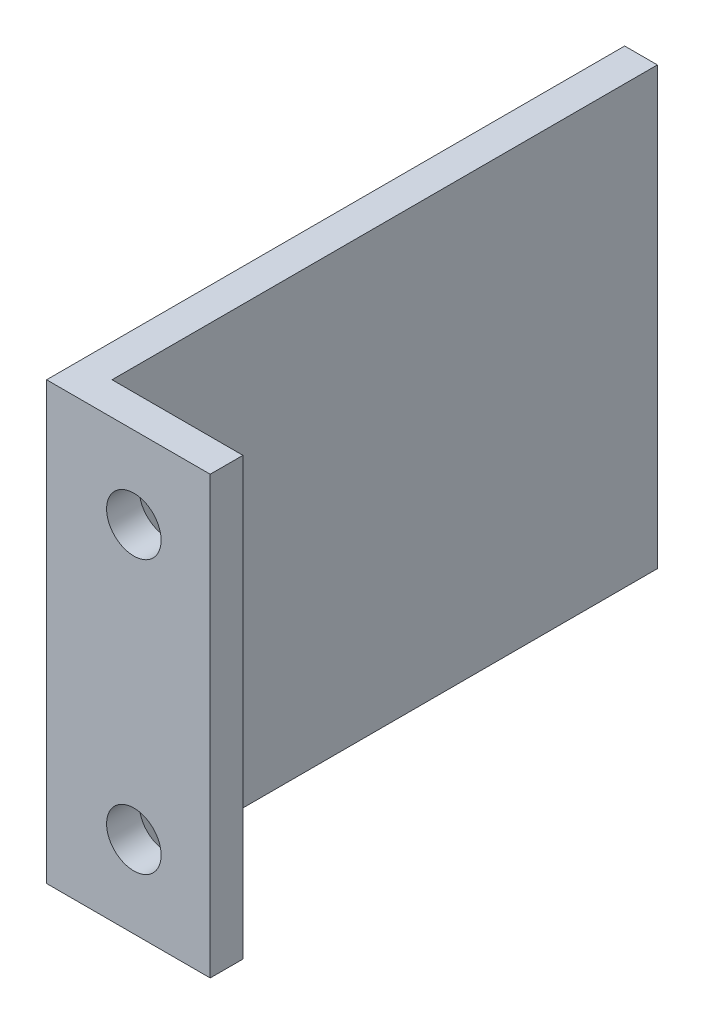
ISO-10303-21;
HEADER;
FILE_DESCRIPTION(('STEP AP214'),'2;1');
FILE_NAME('part.step','',(''),(''),'','','');
FILE_SCHEMA(('AUTOMOTIVE_DESIGN { 1 0 10303 214 1 1 1 1 }'));
ENDSEC;
DATA;
#1=APPLICATION_CONTEXT('core data for automotive mechanical design processes');
#2=APPLICATION_PROTOCOL_DEFINITION('international standard','automotive_design',2000,#1);
#3=PRODUCT_CONTEXT('',#1,'mechanical');
#4=PRODUCT('Part','Part','',(#3));
#5=PRODUCT_RELATED_PRODUCT_CATEGORY('part','',(#4));
#6=PRODUCT_DEFINITION_FORMATION('','',#4);
#7=PRODUCT_DEFINITION_CONTEXT('part definition',#1,'design');
#8=PRODUCT_DEFINITION('design','',#6,#7);
#9=PRODUCT_DEFINITION_SHAPE('','',#8);
#10=(LENGTH_UNIT() NAMED_UNIT(*) SI_UNIT(.MILLI.,.METRE.));
#11=(NAMED_UNIT(*) PLANE_ANGLE_UNIT() SI_UNIT($,.RADIAN.));
#12=(NAMED_UNIT(*) SI_UNIT($,.STERADIAN.) SOLID_ANGLE_UNIT());
#13=UNCERTAINTY_MEASURE_WITH_UNIT(LENGTH_MEASURE(1.E-05),#10,'distance_accuracy_value','');
#14=(GEOMETRIC_REPRESENTATION_CONTEXT(3) GLOBAL_UNCERTAINTY_ASSIGNED_CONTEXT((#13)) GLOBAL_UNIT_ASSIGNED_CONTEXT((#10,
#11,#12)) REPRESENTATION_CONTEXT('',''));
#15=CARTESIAN_POINT('',(0.,0.,0.));
#16=DIRECTION('',(0.,0.,1.));
#17=DIRECTION('',(1.,0.,0.));
#18=AXIS2_PLACEMENT_3D('',#15,#16,#17);
#19=CARTESIAN_POINT('',(0.,0.,0.));
#20=DIRECTION('',(0.,0.,1.));
#21=DIRECTION('',(1.,0.,0.));
#22=AXIS2_PLACEMENT_3D('',#19,#20,#21);
#23=PLANE('',#22);
#24=CARTESIAN_POINT('',(0.499999999999999,-12.5,0.));
#25=DIRECTION('',(0.,0.,1.));
#26=DIRECTION('',(1.,0.,0.));
#27=AXIS2_PLACEMENT_3D('',#24,#25,#26);
#28=CIRCLE('',#27,2.5);
#29=CARTESIAN_POINT('',(3.,-12.5,0.));
#30=VERTEX_POINT('',#29);
#31=EDGE_CURVE('E229',#30,#30,#28,.F.);
#32=ORIENTED_EDGE('',*,*,#31,.F.);
#33=EDGE_LOOP('',(#32));
#34=FACE_BOUND('',#33,.T.);
#35=CARTESIAN_POINT('',(0.499999999999999,12.5,0.));
#36=DIRECTION('',(0.,0.,1.));
#37=DIRECTION('',(1.,0.,0.));
#38=AXIS2_PLACEMENT_3D('',#35,#36,#37);
#39=CIRCLE('',#38,2.5);
#40=CARTESIAN_POINT('',(3.,12.5,0.));
#41=VERTEX_POINT('',#40);
#42=EDGE_CURVE('E115',#41,#41,#39,.F.);
#43=ORIENTED_EDGE('',*,*,#42,.F.);
#44=EDGE_LOOP('',(#43));
#45=FACE_BOUND('',#44,.T.);
#46=DIRECTION('',(0.,-1.,0.));
#47=VECTOR('',#46,1.);
#48=CARTESIAN_POINT('',(-4.5,-20.,0.));
#49=LINE('',#48,#47);
#50=CARTESIAN_POINT('',(-4.5,20.,0.));
#51=VERTEX_POINT('',#50);
#52=CARTESIAN_POINT('',(-4.5,-20.,0.));
#53=VERTEX_POINT('',#52);
#54=EDGE_CURVE('E48',#51,#53,#49,.T.);
#55=ORIENTED_EDGE('',*,*,#54,.F.);
#56=DIRECTION('',(-1.,0.,0.));
#57=VECTOR('',#56,1.);
#58=CARTESIAN_POINT('',(-7.5,20.,0.));
#59=LINE('',#58,#57);
#60=CARTESIAN_POINT('',(7.5,20.,0.));
#61=VERTEX_POINT('',#60);
#62=EDGE_CURVE('E134',#61,#51,#59,.T.);
#63=ORIENTED_EDGE('',*,*,#62,.F.);
#64=DIRECTION('',(0.,1.,0.));
#65=VECTOR('',#64,1.);
#66=CARTESIAN_POINT('',(7.5,20.,0.));
#67=LINE('',#66,#65);
#68=CARTESIAN_POINT('',(7.5,-20.,0.));
#69=VERTEX_POINT('',#68);
#70=EDGE_CURVE('E125',#69,#61,#67,.T.);
#71=ORIENTED_EDGE('',*,*,#70,.F.);
#72=DIRECTION('',(1.,0.,0.));
#73=VECTOR('',#72,1.);
#74=CARTESIAN_POINT('',(-7.5,-20.,0.));
#75=LINE('',#74,#73);
#76=EDGE_CURVE('E70',#53,#69,#75,.T.);
#77=ORIENTED_EDGE('',*,*,#76,.F.);
#78=EDGE_LOOP('',(#55,#63,#71,#77));
#79=FACE_BOUND('',#78,.T.);
#80=ADVANCED_FACE('F33',(#34,#45,#79),#23,.F.);
#81=CARTESIAN_POINT('',(7.5,20.,3.));
#82=DIRECTION('',(-1.,0.,0.));
#83=DIRECTION('',(0.,-1.,0.));
#84=AXIS2_PLACEMENT_3D('',#81,#82,#83);
#85=PLANE('',#84);
#86=ORIENTED_EDGE('',*,*,#70,.T.);
#87=DIRECTION('',(0.,0.,-1.));
#88=VECTOR('',#87,1.);
#89=CARTESIAN_POINT('',(7.5,20.,3.));
#90=LINE('',#89,#88);
#91=CARTESIAN_POINT('',(7.5,20.,3.));
#92=VERTEX_POINT('',#91);
#93=EDGE_CURVE('E11',#92,#61,#90,.T.);
#94=ORIENTED_EDGE('',*,*,#93,.F.);
#95=DIRECTION('',(0.,1.,0.));
#96=VECTOR('',#95,1.);
#97=CARTESIAN_POINT('',(7.5,20.,3.));
#98=LINE('',#97,#96);
#99=CARTESIAN_POINT('',(7.5,-20.,3.));
#100=VERTEX_POINT('',#99);
#101=EDGE_CURVE('E126',#100,#92,#98,.T.);
#102=ORIENTED_EDGE('',*,*,#101,.F.);
#103=DIRECTION('',(0.,0.,-1.));
#104=VECTOR('',#103,1.);
#105=CARTESIAN_POINT('',(7.5,-20.,3.));
#106=LINE('',#105,#104);
#107=EDGE_CURVE('E131',#100,#69,#106,.T.);
#108=ORIENTED_EDGE('',*,*,#107,.T.);
#109=EDGE_LOOP('',(#86,#94,#102,#108));
#110=FACE_BOUND('',#109,.T.);
#111=ADVANCED_FACE('F35',(#110),#85,.F.);
#112=CARTESIAN_POINT('',(-7.5,20.,3.));
#113=DIRECTION('',(0.,-1.,0.));
#114=DIRECTION('',(0.,0.,-1.));
#115=AXIS2_PLACEMENT_3D('',#112,#113,#114);
#116=PLANE('',#115);
#117=ORIENTED_EDGE('',*,*,#62,.T.);
#118=DIRECTION('',(0.,0.,1.));
#119=VECTOR('',#118,1.);
#120=CARTESIAN_POINT('',(-4.5,20.,-50.));
#121=LINE('',#120,#119);
#122=CARTESIAN_POINT('',(-4.5,20.,-50.));
#123=VERTEX_POINT('',#122);
#124=EDGE_CURVE('E105',#123,#51,#121,.T.);
#125=ORIENTED_EDGE('',*,*,#124,.F.);
#126=DIRECTION('',(1.,0.,0.));
#127=VECTOR('',#126,1.);
#128=CARTESIAN_POINT('',(-7.5,20.,-50.));
#129=LINE('',#128,#127);
#130=CARTESIAN_POINT('',(-7.5,20.,-50.));
#131=VERTEX_POINT('',#130);
#132=EDGE_CURVE('E102',#131,#123,#129,.T.);
#133=ORIENTED_EDGE('',*,*,#132,.F.);
#134=DIRECTION('',(0.,0.,-1.));
#135=VECTOR('',#134,1.);
#136=CARTESIAN_POINT('',(-7.5,20.,3.));
#137=LINE('',#136,#135);
#138=CARTESIAN_POINT('',(-7.5,20.,3.));
#139=VERTEX_POINT('',#138);
#140=EDGE_CURVE('E41',#139,#131,#137,.T.);
#141=ORIENTED_EDGE('',*,*,#140,.F.);
#142=DIRECTION('',(-1.,0.,0.));
#143=VECTOR('',#142,1.);
#144=CARTESIAN_POINT('',(-7.5,20.,3.));
#145=LINE('',#144,#143);
#146=EDGE_CURVE('E77',#92,#139,#145,.T.);
#147=ORIENTED_EDGE('',*,*,#146,.F.);
#148=ORIENTED_EDGE('',*,*,#93,.T.);
#149=EDGE_LOOP('',(#117,#125,#133,#141,#147,#148));
#150=FACE_BOUND('',#149,.T.);
#151=ADVANCED_FACE('F103',(#150),#116,.F.);
#152=CARTESIAN_POINT('',(-7.5,20.,3.));
#153=DIRECTION('',(1.,0.,0.));
#154=DIRECTION('',(0.,1.,0.));
#155=AXIS2_PLACEMENT_3D('',#152,#153,#154);
#156=PLANE('',#155);
#157=ORIENTED_EDGE('',*,*,#140,.T.);
#158=DIRECTION('',(0.,1.,0.));
#159=VECTOR('',#158,1.);
#160=CARTESIAN_POINT('',(-7.5,-20.,-50.));
#161=LINE('',#160,#159);
#162=CARTESIAN_POINT('',(-7.5,-20.,-50.));
#163=VERTEX_POINT('',#162);
#164=EDGE_CURVE('E98',#163,#131,#161,.T.);
#165=ORIENTED_EDGE('',*,*,#164,.F.);
#166=DIRECTION('',(0.,0.,-1.));
#167=VECTOR('',#166,1.);
#168=CARTESIAN_POINT('',(-7.5,-20.,3.));
#169=LINE('',#168,#167);
#170=CARTESIAN_POINT('',(-7.5,-20.,3.));
#171=VERTEX_POINT('',#170);
#172=EDGE_CURVE('E100',#171,#163,#169,.T.);
#173=ORIENTED_EDGE('',*,*,#172,.F.);
#174=DIRECTION('',(0.,-1.,0.));
#175=VECTOR('',#174,1.);
#176=CARTESIAN_POINT('',(-7.5,20.,3.));
#177=LINE('',#176,#175);
#178=EDGE_CURVE('E99',#139,#171,#177,.T.);
#179=ORIENTED_EDGE('',*,*,#178,.F.);
#180=EDGE_LOOP('',(#157,#165,#173,#179));
#181=FACE_BOUND('',#180,.T.);
#182=ADVANCED_FACE('F95',(#181),#156,.F.);
#183=CARTESIAN_POINT('',(-7.5,-20.,3.));
#184=DIRECTION('',(0.,1.,0.));
#185=DIRECTION('',(0.,0.,1.));
#186=AXIS2_PLACEMENT_3D('',#183,#184,#185);
#187=PLANE('',#186);
#188=ORIENTED_EDGE('',*,*,#172,.T.);
#189=DIRECTION('',(-1.,0.,0.));
#190=VECTOR('',#189,1.);
#191=CARTESIAN_POINT('',(-7.5,-20.,-50.));
#192=LINE('',#191,#190);
#193=CARTESIAN_POINT('',(-4.5,-20.,-50.));
#194=VERTEX_POINT('',#193);
#195=EDGE_CURVE('E113',#194,#163,#192,.T.);
#196=ORIENTED_EDGE('',*,*,#195,.F.);
#197=DIRECTION('',(0.,0.,1.));
#198=VECTOR('',#197,1.);
#199=CARTESIAN_POINT('',(-4.5,-20.,-50.));
#200=LINE('',#199,#198);
#201=EDGE_CURVE('E121',#194,#53,#200,.T.);
#202=ORIENTED_EDGE('',*,*,#201,.T.);
#203=ORIENTED_EDGE('',*,*,#76,.T.);
#204=ORIENTED_EDGE('',*,*,#107,.F.);
#205=DIRECTION('',(1.,0.,0.));
#206=VECTOR('',#205,1.);
#207=CARTESIAN_POINT('',(-7.5,-20.,3.));
#208=LINE('',#207,#206);
#209=EDGE_CURVE('E57',#171,#100,#208,.T.);
#210=ORIENTED_EDGE('',*,*,#209,.F.);
#211=EDGE_LOOP('',(#188,#196,#202,#203,#204,#210));
#212=FACE_BOUND('',#211,.T.);
#213=ADVANCED_FACE('F138',(#212),#187,.F.);
#214=CARTESIAN_POINT('',(0.,0.,3.));
#215=DIRECTION('',(0.,0.,1.));
#216=DIRECTION('',(1.,0.,0.));
#217=AXIS2_PLACEMENT_3D('',#214,#215,#216);
#218=PLANE('',#217);
#219=CARTESIAN_POINT('',(0.499999999999999,-12.5,3.));
#220=DIRECTION('',(0.,0.,1.));
#221=DIRECTION('',(1.,0.,0.));
#222=AXIS2_PLACEMENT_3D('',#219,#220,#221);
#223=CIRCLE('',#222,2.5);
#224=CARTESIAN_POINT('',(3.,-12.5,3.));
#225=VERTEX_POINT('',#224);
#226=EDGE_CURVE('E231',#225,#225,#223,.T.);
#227=ORIENTED_EDGE('',*,*,#226,.F.);
#228=EDGE_LOOP('',(#227));
#229=FACE_BOUND('',#228,.T.);
#230=CARTESIAN_POINT('',(0.499999999999999,12.5,3.));
#231=DIRECTION('',(0.,0.,1.));
#232=DIRECTION('',(1.,0.,0.));
#233=AXIS2_PLACEMENT_3D('',#230,#231,#232);
#234=CIRCLE('',#233,2.5);
#235=CARTESIAN_POINT('',(3.,12.5,3.));
#236=VERTEX_POINT('',#235);
#237=EDGE_CURVE('E233',#236,#236,#234,.T.);
#238=ORIENTED_EDGE('',*,*,#237,.F.);
#239=EDGE_LOOP('',(#238));
#240=FACE_BOUND('',#239,.T.);
#241=ORIENTED_EDGE('',*,*,#101,.T.);
#242=ORIENTED_EDGE('',*,*,#146,.T.);
#243=ORIENTED_EDGE('',*,*,#178,.T.);
#244=ORIENTED_EDGE('',*,*,#209,.T.);
#245=EDGE_LOOP('',(#241,#242,#243,#244));
#246=FACE_BOUND('',#245,.T.);
#247=ADVANCED_FACE('F143',(#229,#240,#246),#218,.T.);
#248=CARTESIAN_POINT('',(-4.5,-20.,-50.));
#249=DIRECTION('',(-1.,0.,0.));
#250=DIRECTION('',(0.,0.,1.));
#251=AXIS2_PLACEMENT_3D('',#248,#249,#250);
#252=PLANE('',#251);
#253=ORIENTED_EDGE('',*,*,#54,.T.);
#254=ORIENTED_EDGE('',*,*,#201,.F.);
#255=DIRECTION('',(0.,-1.,0.));
#256=VECTOR('',#255,1.);
#257=CARTESIAN_POINT('',(-4.5,-20.,-50.));
#258=LINE('',#257,#256);
#259=EDGE_CURVE('E108',#123,#194,#258,.T.);
#260=ORIENTED_EDGE('',*,*,#259,.F.);
#261=ORIENTED_EDGE('',*,*,#124,.T.);
#262=EDGE_LOOP('',(#253,#254,#260,#261));
#263=FACE_BOUND('',#262,.T.);
#264=ADVANCED_FACE('F145',(#263),#252,.F.);
#265=CARTESIAN_POINT('',(0.,0.,-50.));
#266=DIRECTION('',(0.,0.,-1.));
#267=DIRECTION('',(-1.,0.,0.));
#268=AXIS2_PLACEMENT_3D('',#265,#266,#267);
#269=PLANE('',#268);
#270=ORIENTED_EDGE('',*,*,#164,.T.);
#271=ORIENTED_EDGE('',*,*,#132,.T.);
#272=ORIENTED_EDGE('',*,*,#259,.T.);
#273=ORIENTED_EDGE('',*,*,#195,.T.);
#274=EDGE_LOOP('',(#270,#271,#272,#273));
#275=FACE_BOUND('',#274,.T.);
#276=ADVANCED_FACE('F111',(#275),#269,.T.);
#277=CARTESIAN_POINT('',(0.499999999999999,12.5,-7.07106781186548));
#278=DIRECTION('',(0.,0.,1.));
#279=DIRECTION('',(1.,0.,0.));
#280=AXIS2_PLACEMENT_3D('',#277,#278,#279);
#281=CYLINDRICAL_SURFACE('',#280,2.5);
#282=ORIENTED_EDGE('',*,*,#42,.T.);
#283=EDGE_LOOP('',(#282));
#284=FACE_BOUND('',#283,.T.);
#285=ORIENTED_EDGE('',*,*,#237,.T.);
#286=EDGE_LOOP('',(#285));
#287=FACE_BOUND('',#286,.T.);
#288=ADVANCED_FACE('F196',(#284,#287),#281,.F.);
#289=CARTESIAN_POINT('',(0.499999999999999,-12.5,-7.07106781186548));
#290=DIRECTION('',(0.,0.,1.));
#291=DIRECTION('',(1.,0.,0.));
#292=AXIS2_PLACEMENT_3D('',#289,#290,#291);
#293=CYLINDRICAL_SURFACE('',#292,2.5);
#294=ORIENTED_EDGE('',*,*,#31,.T.);
#295=EDGE_LOOP('',(#294));
#296=FACE_BOUND('',#295,.T.);
#297=ORIENTED_EDGE('',*,*,#226,.T.);
#298=EDGE_LOOP('',(#297));
#299=FACE_BOUND('',#298,.T.);
#300=ADVANCED_FACE('F204',(#296,#299),#293,.F.);
#301=CLOSED_SHELL('',(#80,#111,#151,#182,#213,#247,#264,#276,#288,#300));
#302=MANIFOLD_SOLID_BREP('B2',#301);
#303=ADVANCED_BREP_SHAPE_REPRESENTATION('',(#18,#302),#14);
#304=SHAPE_DEFINITION_REPRESENTATION(#9,#303);
ENDSEC;
END-ISO-10303-21;
